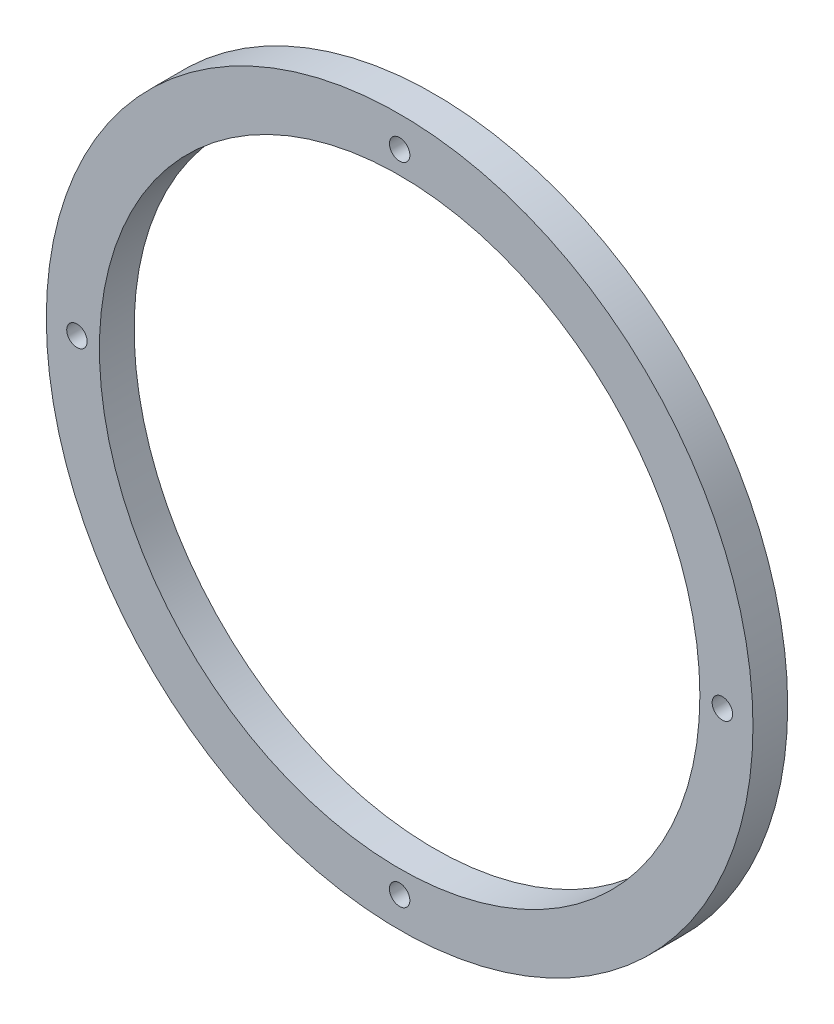
ISO-10303-21;
HEADER;
FILE_DESCRIPTION(('STEP AP214'),'2;1');
FILE_NAME('part.step','',(''),(''),'','','');
FILE_SCHEMA(('AUTOMOTIVE_DESIGN { 1 0 10303 214 1 1 1 1 }'));
ENDSEC;
DATA;
#1=APPLICATION_CONTEXT('core data for automotive mechanical design processes');
#2=APPLICATION_PROTOCOL_DEFINITION('international standard','automotive_design',2000,#1);
#3=PRODUCT_CONTEXT('',#1,'mechanical');
#4=PRODUCT('Part','Part','',(#3));
#5=PRODUCT_RELATED_PRODUCT_CATEGORY('part','',(#4));
#6=PRODUCT_DEFINITION_FORMATION('','',#4);
#7=PRODUCT_DEFINITION_CONTEXT('part definition',#1,'design');
#8=PRODUCT_DEFINITION('design','',#6,#7);
#9=PRODUCT_DEFINITION_SHAPE('','',#8);
#10=(LENGTH_UNIT() NAMED_UNIT(*) SI_UNIT(.MILLI.,.METRE.));
#11=(NAMED_UNIT(*) PLANE_ANGLE_UNIT() SI_UNIT($,.RADIAN.));
#12=(NAMED_UNIT(*) SI_UNIT($,.STERADIAN.) SOLID_ANGLE_UNIT());
#13=UNCERTAINTY_MEASURE_WITH_UNIT(LENGTH_MEASURE(1.E-05),#10,'distance_accuracy_value','');
#14=(GEOMETRIC_REPRESENTATION_CONTEXT(3) GLOBAL_UNCERTAINTY_ASSIGNED_CONTEXT((#13)) GLOBAL_UNIT_ASSIGNED_CONTEXT((#10,
#11,#12)) REPRESENTATION_CONTEXT('',''));
#15=CARTESIAN_POINT('',(0.,0.,0.));
#16=DIRECTION('',(0.,0.,1.));
#17=DIRECTION('',(1.,0.,0.));
#18=AXIS2_PLACEMENT_3D('',#15,#16,#17);
#19=CARTESIAN_POINT('',(0.,0.,0.));
#20=DIRECTION('',(0.,0.,1.));
#21=DIRECTION('',(1.,0.,0.));
#22=AXIS2_PLACEMENT_3D('',#19,#20,#21);
#23=PLANE('',#22);
#24=CARTESIAN_POINT('',(2.68646881641785E-12,-79.,0.));
#25=DIRECTION('',(0.,0.,-1.));
#26=DIRECTION('',(-1.,0.,0.));
#27=AXIS2_PLACEMENT_3D('',#24,#25,#26);
#28=CIRCLE('',#27,4.7);
#29=CARTESIAN_POINT('',(-4.69999999999731,-79.,0.));
#30=VERTEX_POINT('',#29);
#31=EDGE_CURVE('E63',#30,#30,#28,.T.);
#32=ORIENTED_EDGE('',*,*,#31,.F.);
#33=EDGE_LOOP('',(#32));
#34=FACE_BOUND('',#33,.T.);
#35=CARTESIAN_POINT('',(0.,0.,0.));
#36=DIRECTION('',(0.,0.,1.));
#37=DIRECTION('',(1.,0.,0.));
#38=AXIS2_PLACEMENT_3D('',#35,#36,#37);
#39=CIRCLE('',#38,73.5);
#40=CARTESIAN_POINT('',(73.5,0.,0.));
#41=VERTEX_POINT('',#40);
#42=EDGE_CURVE('E53',#41,#41,#39,.T.);
#43=ORIENTED_EDGE('',*,*,#42,.T.);
#44=EDGE_LOOP('',(#43));
#45=FACE_BOUND('',#44,.T.);
#46=CARTESIAN_POINT('',(0.,0.,0.));
#47=DIRECTION('',(0.,0.,1.));
#48=DIRECTION('',(1.,0.,0.));
#49=AXIS2_PLACEMENT_3D('',#46,#47,#48);
#50=CIRCLE('',#49,86.5);
#51=CARTESIAN_POINT('',(86.5,0.,0.));
#52=VERTEX_POINT('',#51);
#53=EDGE_CURVE('E56',#52,#52,#50,.T.);
#54=ORIENTED_EDGE('',*,*,#53,.F.);
#55=EDGE_LOOP('',(#54));
#56=FACE_BOUND('',#55,.T.);
#57=CARTESIAN_POINT('',(0.,79.,0.));
#58=DIRECTION('',(0.,0.,-1.));
#59=DIRECTION('',(-1.,0.,0.));
#60=AXIS2_PLACEMENT_3D('',#57,#58,#59);
#61=CIRCLE('',#60,4.7);
#62=CARTESIAN_POINT('',(-4.7,79.,0.));
#63=VERTEX_POINT('',#62);
#64=EDGE_CURVE('E64',#63,#63,#61,.T.);
#65=ORIENTED_EDGE('',*,*,#64,.F.);
#66=EDGE_LOOP('',(#65));
#67=FACE_BOUND('',#66,.T.);
#68=CARTESIAN_POINT('',(-78.9999999999987,-1.35290911792219E-12,0.));
#69=DIRECTION('',(0.,0.,-1.));
#70=DIRECTION('',(-1.,0.,0.));
#71=AXIS2_PLACEMENT_3D('',#68,#69,#70);
#72=CIRCLE('',#71,4.7);
#73=CARTESIAN_POINT('',(-83.6999999999987,-1.35290911792219E-12,0.));
#74=VERTEX_POINT('',#73);
#75=EDGE_CURVE('E67',#74,#74,#72,.T.);
#76=ORIENTED_EDGE('',*,*,#75,.F.);
#77=EDGE_LOOP('',(#76));
#78=FACE_BOUND('',#77,.T.);
#79=CARTESIAN_POINT('',(79.0000000000014,1.34323440820892E-12,0.));
#80=DIRECTION('',(0.,0.,-1.));
#81=DIRECTION('',(-1.,0.,0.));
#82=AXIS2_PLACEMENT_3D('',#79,#80,#81);
#83=CIRCLE('',#82,4.7);
#84=CARTESIAN_POINT('',(74.3000000000013,1.34323440820892E-12,0.));
#85=VERTEX_POINT('',#84);
#86=EDGE_CURVE('E77',#85,#85,#83,.T.);
#87=ORIENTED_EDGE('',*,*,#86,.F.);
#88=EDGE_LOOP('',(#87));
#89=FACE_BOUND('',#88,.T.);
#90=ADVANCED_FACE('F36',(#34,#45,#56,#67,#78,#89),#23,.F.);
#91=CARTESIAN_POINT('',(0.,0.,8.5));
#92=DIRECTION('',(0.,0.,-1.));
#93=DIRECTION('',(-1.,0.,0.));
#94=AXIS2_PLACEMENT_3D('',#91,#92,#93);
#95=CYLINDRICAL_SURFACE('',#94,73.5);
#96=CARTESIAN_POINT('',(0.,0.,8.5));
#97=DIRECTION('',(0.,0.,1.));
#98=DIRECTION('',(1.,0.,0.));
#99=AXIS2_PLACEMENT_3D('',#96,#97,#98);
#100=CIRCLE('',#99,73.5);
#101=CARTESIAN_POINT('',(73.5,0.,8.5));
#102=VERTEX_POINT('',#101);
#103=EDGE_CURVE('E44',#102,#102,#100,.T.);
#104=ORIENTED_EDGE('',*,*,#103,.T.);
#105=EDGE_LOOP('',(#104));
#106=FACE_BOUND('',#105,.T.);
#107=ORIENTED_EDGE('',*,*,#42,.F.);
#108=EDGE_LOOP('',(#107));
#109=FACE_BOUND('',#108,.T.);
#110=ADVANCED_FACE('F105',(#106,#109),#95,.F.);
#111=CARTESIAN_POINT('',(0.,79.,8.5));
#112=DIRECTION('',(0.,0.,-1.));
#113=DIRECTION('',(-1.,0.,0.));
#114=AXIS2_PLACEMENT_3D('',#111,#112,#113);
#115=CYLINDRICAL_SURFACE('',#114,2.5);
#116=CARTESIAN_POINT('',(0.,79.,2.2));
#117=DIRECTION('',(0.,0.,-1.));
#118=DIRECTION('',(-1.,0.,0.));
#119=AXIS2_PLACEMENT_3D('',#116,#117,#118);
#120=CIRCLE('',#119,2.5);
#121=CARTESIAN_POINT('',(-2.5,79.,2.2));
#122=VERTEX_POINT('',#121);
#123=EDGE_CURVE('E61',#122,#122,#120,.F.);
#124=ORIENTED_EDGE('',*,*,#123,.F.);
#125=EDGE_LOOP('',(#124));
#126=FACE_BOUND('',#125,.T.);
#127=CARTESIAN_POINT('',(0.,79.,8.5));
#128=DIRECTION('',(0.,0.,1.));
#129=DIRECTION('',(1.,0.,0.));
#130=AXIS2_PLACEMENT_3D('',#127,#128,#129);
#131=CIRCLE('',#130,2.5);
#132=CARTESIAN_POINT('',(2.5,79.,8.5));
#133=VERTEX_POINT('',#132);
#134=EDGE_CURVE('E49',#133,#133,#131,.T.);
#135=ORIENTED_EDGE('',*,*,#134,.T.);
#136=EDGE_LOOP('',(#135));
#137=FACE_BOUND('',#136,.T.);
#138=ADVANCED_FACE('F94',(#126,#137),#115,.F.);
#139=CARTESIAN_POINT('',(79.0000000000014,1.34323440820892E-12,8.5));
#140=DIRECTION('',(0.,0.,-1.));
#141=DIRECTION('',(-1.,0.,0.));
#142=AXIS2_PLACEMENT_3D('',#139,#140,#141);
#143=CYLINDRICAL_SURFACE('',#142,2.5);
#144=CARTESIAN_POINT('',(79.0000000000014,1.34323440820892E-12,2.20000000000001));
#145=DIRECTION('',(0.,0.,-1.));
#146=DIRECTION('',(-1.,0.,0.));
#147=AXIS2_PLACEMENT_3D('',#144,#145,#146);
#148=CIRCLE('',#147,2.5);
#149=CARTESIAN_POINT('',(76.5000000000014,1.34323440820892E-12,2.20000000000001));
#150=VERTEX_POINT('',#149);
#151=EDGE_CURVE('E40',#150,#150,#148,.F.);
#152=ORIENTED_EDGE('',*,*,#151,.F.);
#153=EDGE_LOOP('',(#152));
#154=FACE_BOUND('',#153,.T.);
#155=CARTESIAN_POINT('',(79.0000000000014,1.34323440820892E-12,8.5));
#156=DIRECTION('',(0.,0.,1.));
#157=DIRECTION('',(1.,0.,0.));
#158=AXIS2_PLACEMENT_3D('',#155,#156,#157);
#159=CIRCLE('',#158,2.5);
#160=CARTESIAN_POINT('',(81.5000000000014,1.34323440820892E-12,8.5));
#161=VERTEX_POINT('',#160);
#162=EDGE_CURVE('E89',#161,#161,#159,.T.);
#163=ORIENTED_EDGE('',*,*,#162,.T.);
#164=EDGE_LOOP('',(#163));
#165=FACE_BOUND('',#164,.T.);
#166=ADVANCED_FACE('F145',(#154,#165),#143,.F.);
#167=CARTESIAN_POINT('',(2.68646881641785E-12,-79.,8.5));
#168=DIRECTION('',(0.,0.,-1.));
#169=DIRECTION('',(-1.,0.,0.));
#170=AXIS2_PLACEMENT_3D('',#167,#168,#169);
#171=CYLINDRICAL_SURFACE('',#170,2.5);
#172=CARTESIAN_POINT('',(2.68646881641785E-12,-79.,2.2));
#173=DIRECTION('',(0.,0.,-1.));
#174=DIRECTION('',(-1.,0.,0.));
#175=AXIS2_PLACEMENT_3D('',#172,#173,#174);
#176=CIRCLE('',#175,2.5);
#177=CARTESIAN_POINT('',(-2.49999999999732,-79.,2.2));
#178=VERTEX_POINT('',#177);
#179=EDGE_CURVE('E57',#178,#178,#176,.F.);
#180=ORIENTED_EDGE('',*,*,#179,.F.);
#181=EDGE_LOOP('',(#180));
#182=FACE_BOUND('',#181,.T.);
#183=CARTESIAN_POINT('',(2.68646881641785E-12,-79.,8.5));
#184=DIRECTION('',(0.,0.,1.));
#185=DIRECTION('',(1.,0.,0.));
#186=AXIS2_PLACEMENT_3D('',#183,#184,#185);
#187=CIRCLE('',#186,2.5);
#188=CARTESIAN_POINT('',(2.50000000000269,-79.,8.5));
#189=VERTEX_POINT('',#188);
#190=EDGE_CURVE('E86',#189,#189,#187,.T.);
#191=ORIENTED_EDGE('',*,*,#190,.T.);
#192=EDGE_LOOP('',(#191));
#193=FACE_BOUND('',#192,.T.);
#194=ADVANCED_FACE('F148',(#182,#193),#171,.F.);
#195=CARTESIAN_POINT('',(-78.9999999999987,-1.35290911792219E-12,8.5));
#196=DIRECTION('',(0.,0.,-1.));
#197=DIRECTION('',(-1.,0.,0.));
#198=AXIS2_PLACEMENT_3D('',#195,#196,#197);
#199=CYLINDRICAL_SURFACE('',#198,2.49999999999999);
#200=CARTESIAN_POINT('',(-78.9999999999987,-1.35290911792219E-12,2.20000000000001));
#201=DIRECTION('',(0.,0.,-1.));
#202=DIRECTION('',(-1.,0.,0.));
#203=AXIS2_PLACEMENT_3D('',#200,#201,#202);
#204=CIRCLE('',#203,2.49999999999999);
#205=CARTESIAN_POINT('',(-81.4999999999986,-1.35290911792219E-12,2.20000000000001));
#206=VERTEX_POINT('',#205);
#207=EDGE_CURVE('E65',#206,#206,#204,.F.);
#208=ORIENTED_EDGE('',*,*,#207,.F.);
#209=EDGE_LOOP('',(#208));
#210=FACE_BOUND('',#209,.T.);
#211=CARTESIAN_POINT('',(-78.9999999999987,-1.35290911792219E-12,8.5));
#212=DIRECTION('',(0.,0.,1.));
#213=DIRECTION('',(1.,0.,0.));
#214=AXIS2_PLACEMENT_3D('',#211,#212,#213);
#215=CIRCLE('',#214,2.49999999999999);
#216=CARTESIAN_POINT('',(-76.4999999999987,-1.35290911792219E-12,8.5));
#217=VERTEX_POINT('',#216);
#218=EDGE_CURVE('E60',#217,#217,#215,.T.);
#219=ORIENTED_EDGE('',*,*,#218,.T.);
#220=EDGE_LOOP('',(#219));
#221=FACE_BOUND('',#220,.T.);
#222=ADVANCED_FACE('F38',(#210,#221),#199,.F.);
#223=CARTESIAN_POINT('',(0.,0.,8.5));
#224=DIRECTION('',(0.,0.,-1.));
#225=DIRECTION('',(-1.,0.,0.));
#226=AXIS2_PLACEMENT_3D('',#223,#224,#225);
#227=CYLINDRICAL_SURFACE('',#226,86.5);
#228=CARTESIAN_POINT('',(0.,0.,8.5));
#229=DIRECTION('',(0.,0.,1.));
#230=DIRECTION('',(1.,0.,0.));
#231=AXIS2_PLACEMENT_3D('',#228,#229,#230);
#232=CIRCLE('',#231,86.5);
#233=CARTESIAN_POINT('',(86.5,0.,8.5));
#234=VERTEX_POINT('',#233);
#235=EDGE_CURVE('E10',#234,#234,#232,.T.);
#236=ORIENTED_EDGE('',*,*,#235,.F.);
#237=EDGE_LOOP('',(#236));
#238=FACE_BOUND('',#237,.T.);
#239=ORIENTED_EDGE('',*,*,#53,.T.);
#240=EDGE_LOOP('',(#239));
#241=FACE_BOUND('',#240,.T.);
#242=ADVANCED_FACE('F100',(#238,#241),#227,.T.);
#243=CARTESIAN_POINT('',(0.,0.,8.5));
#244=DIRECTION('',(0.,0.,1.));
#245=DIRECTION('',(1.,0.,0.));
#246=AXIS2_PLACEMENT_3D('',#243,#244,#245);
#247=PLANE('',#246);
#248=ORIENTED_EDGE('',*,*,#218,.F.);
#249=EDGE_LOOP('',(#248));
#250=FACE_BOUND('',#249,.T.);
#251=ORIENTED_EDGE('',*,*,#190,.F.);
#252=EDGE_LOOP('',(#251));
#253=FACE_BOUND('',#252,.T.);
#254=ORIENTED_EDGE('',*,*,#162,.F.);
#255=EDGE_LOOP('',(#254));
#256=FACE_BOUND('',#255,.T.);
#257=ORIENTED_EDGE('',*,*,#134,.F.);
#258=EDGE_LOOP('',(#257));
#259=FACE_BOUND('',#258,.T.);
#260=ORIENTED_EDGE('',*,*,#103,.F.);
#261=EDGE_LOOP('',(#260));
#262=FACE_BOUND('',#261,.T.);
#263=ORIENTED_EDGE('',*,*,#235,.T.);
#264=EDGE_LOOP('',(#263));
#265=FACE_BOUND('',#264,.T.);
#266=ADVANCED_FACE('F96',(#250,#253,#256,#259,#262,#265),#247,.T.);
#267=CARTESIAN_POINT('',(2.68646881641785E-12,-79.,0.));
#268=DIRECTION('',(0.,0.,-1.));
#269=DIRECTION('',(-1.,0.,0.));
#270=AXIS2_PLACEMENT_3D('',#267,#268,#269);
#271=CONICAL_SURFACE('',#270,4.7,0.785398163397448);
#272=ORIENTED_EDGE('',*,*,#179,.T.);
#273=EDGE_LOOP('',(#272));
#274=FACE_BOUND('',#273,.T.);
#275=ORIENTED_EDGE('',*,*,#31,.T.);
#276=EDGE_LOOP('',(#275));
#277=FACE_BOUND('',#276,.T.);
#278=ADVANCED_FACE('F99',(#274,#277),#271,.F.);
#279=CARTESIAN_POINT('',(0.,79.,0.));
#280=DIRECTION('',(0.,0.,-1.));
#281=DIRECTION('',(-1.,0.,0.));
#282=AXIS2_PLACEMENT_3D('',#279,#280,#281);
#283=CONICAL_SURFACE('',#282,4.7,0.785398163397448);
#284=ORIENTED_EDGE('',*,*,#123,.T.);
#285=EDGE_LOOP('',(#284));
#286=FACE_BOUND('',#285,.T.);
#287=ORIENTED_EDGE('',*,*,#64,.T.);
#288=EDGE_LOOP('',(#287));
#289=FACE_BOUND('',#288,.T.);
#290=ADVANCED_FACE('F131',(#286,#289),#283,.F.);
#291=CARTESIAN_POINT('',(-78.9999999999987,-1.35290911792219E-12,0.));
#292=DIRECTION('',(0.,0.,-1.));
#293=DIRECTION('',(-1.,0.,0.));
#294=AXIS2_PLACEMENT_3D('',#291,#292,#293);
#295=CONICAL_SURFACE('',#294,4.7,0.785398163397447);
#296=ORIENTED_EDGE('',*,*,#207,.T.);
#297=EDGE_LOOP('',(#296));
#298=FACE_BOUND('',#297,.T.);
#299=ORIENTED_EDGE('',*,*,#75,.T.);
#300=EDGE_LOOP('',(#299));
#301=FACE_BOUND('',#300,.T.);
#302=ADVANCED_FACE('F125',(#298,#301),#295,.F.);
#303=CARTESIAN_POINT('',(79.0000000000014,1.34323440820892E-12,0.));
#304=DIRECTION('',(0.,0.,-1.));
#305=DIRECTION('',(-1.,0.,0.));
#306=AXIS2_PLACEMENT_3D('',#303,#304,#305);
#307=CONICAL_SURFACE('',#306,4.7,0.785398163397447);
#308=ORIENTED_EDGE('',*,*,#151,.T.);
#309=EDGE_LOOP('',(#308));
#310=FACE_BOUND('',#309,.T.);
#311=ORIENTED_EDGE('',*,*,#86,.T.);
#312=EDGE_LOOP('',(#311));
#313=FACE_BOUND('',#312,.T.);
#314=ADVANCED_FACE('F123',(#310,#313),#307,.F.);
#315=CLOSED_SHELL('',(#90,#110,#138,#166,#194,#222,#242,#266,#278,#290,#302,#314));
#316=MANIFOLD_SOLID_BREP('B2',#315);
#317=ADVANCED_BREP_SHAPE_REPRESENTATION('',(#18,#316),#14);
#318=SHAPE_DEFINITION_REPRESENTATION(#9,#317);
ENDSEC;
END-ISO-10303-21;
